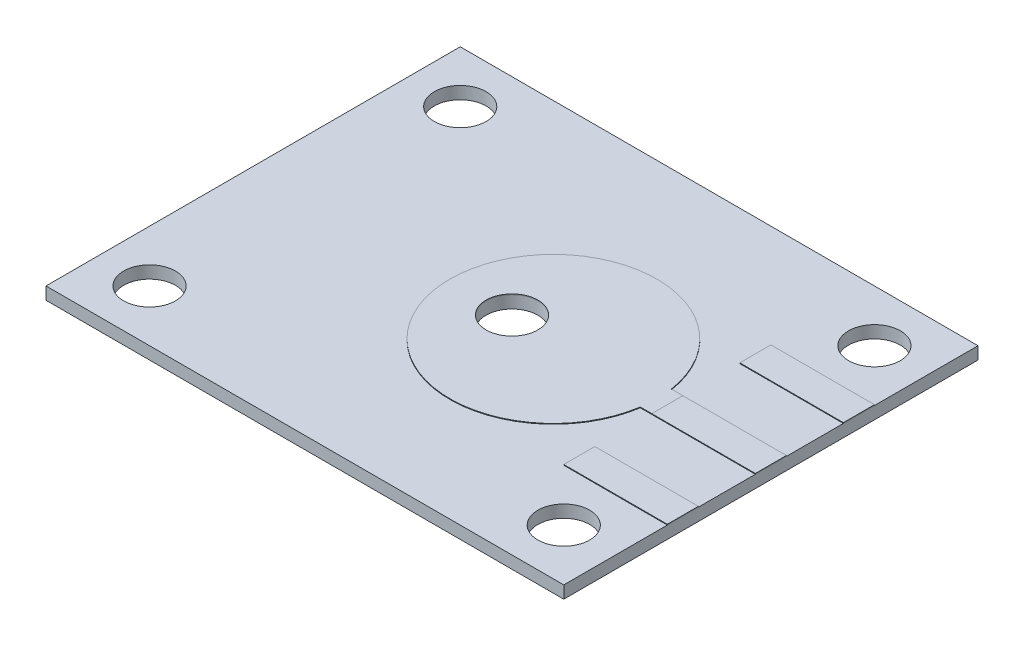
ISO-10303-21;
HEADER;
FILE_DESCRIPTION(('STEP AP214'),'2;1');
FILE_NAME('part.step','',(''),(''),'','','');
FILE_SCHEMA(('AUTOMOTIVE_DESIGN { 1 0 10303 214 1 1 1 1 }'));
ENDSEC;
DATA;
#1=APPLICATION_CONTEXT('core data for automotive mechanical design processes');
#2=APPLICATION_PROTOCOL_DEFINITION('international standard','automotive_design',2000,#1);
#3=PRODUCT_CONTEXT('',#1,'mechanical');
#4=PRODUCT('Part','Part','',(#3));
#5=PRODUCT_RELATED_PRODUCT_CATEGORY('part','',(#4));
#6=PRODUCT_DEFINITION_FORMATION('','',#4);
#7=PRODUCT_DEFINITION_CONTEXT('part definition',#1,'design');
#8=PRODUCT_DEFINITION('design','',#6,#7);
#9=PRODUCT_DEFINITION_SHAPE('','',#8);
#10=(LENGTH_UNIT() NAMED_UNIT(*) SI_UNIT(.MILLI.,.METRE.));
#11=(NAMED_UNIT(*) PLANE_ANGLE_UNIT() SI_UNIT($,.RADIAN.));
#12=(NAMED_UNIT(*) SI_UNIT($,.STERADIAN.) SOLID_ANGLE_UNIT());
#13=UNCERTAINTY_MEASURE_WITH_UNIT(LENGTH_MEASURE(1.E-05),#10,'distance_accuracy_value','');
#14=(GEOMETRIC_REPRESENTATION_CONTEXT(3) GLOBAL_UNCERTAINTY_ASSIGNED_CONTEXT((#13)) GLOBAL_UNIT_ASSIGNED_CONTEXT((#10,
#11,#12)) REPRESENTATION_CONTEXT('',''));
#15=CARTESIAN_POINT('',(0.,0.,0.));
#16=DIRECTION('',(0.,0.,1.));
#17=DIRECTION('',(1.,0.,0.));
#18=AXIS2_PLACEMENT_3D('',#15,#16,#17);
#19=CARTESIAN_POINT('',(2.,0.,0.));
#20=DIRECTION('',(0.,-1.,0.));
#21=DIRECTION('',(0.,0.,-1.));
#22=AXIS2_PLACEMENT_3D('',#19,#20,#21);
#23=CYLINDRICAL_SURFACE('',#22,5.);
#24=CARTESIAN_POINT('',(2.,-0.0350000000000001,0.));
#25=DIRECTION('',(0.,1.,0.));
#26=DIRECTION('',(0.,0.,1.));
#27=AXIS2_PLACEMENT_3D('',#24,#25,#26);
#28=CIRCLE('',#27,5.);
#29=CARTESIAN_POINT('',(6.9434299833213,-0.0350000000000001,-0.75));
#30=VERTEX_POINT('',#29);
#31=CARTESIAN_POINT('',(6.9434299833213,-0.0350000000000001,0.75));
#32=VERTEX_POINT('',#31);
#33=EDGE_CURVE('E124',#30,#32,#28,.T.);
#34=ORIENTED_EDGE('',*,*,#33,.T.);
#35=DIRECTION('',(0.,-1.,0.));
#36=VECTOR('',#35,1.);
#37=CARTESIAN_POINT('',(6.9434299833213,0.,0.75));
#38=LINE('',#37,#36);
#39=CARTESIAN_POINT('',(6.9434299833213,0.,0.75));
#40=VERTEX_POINT('',#39);
#41=EDGE_CURVE('E79',#40,#32,#38,.T.);
#42=ORIENTED_EDGE('',*,*,#41,.F.);
#43=CARTESIAN_POINT('',(2.,0.,0.));
#44=DIRECTION('',(0.,1.,0.));
#45=DIRECTION('',(0.,0.,1.));
#46=AXIS2_PLACEMENT_3D('',#43,#44,#45);
#47=CIRCLE('',#46,5.);
#48=CARTESIAN_POINT('',(6.9434299833213,0.,-0.75));
#49=VERTEX_POINT('',#48);
#50=EDGE_CURVE('E136',#49,#40,#47,.T.);
#51=ORIENTED_EDGE('',*,*,#50,.F.);
#52=DIRECTION('',(0.,-1.,0.));
#53=VECTOR('',#52,1.);
#54=CARTESIAN_POINT('',(6.9434299833213,0.,-0.75));
#55=LINE('',#54,#53);
#56=EDGE_CURVE('E13',#49,#30,#55,.T.);
#57=ORIENTED_EDGE('',*,*,#56,.T.);
#58=EDGE_LOOP('',(#34,#42,#51,#57));
#59=FACE_BOUND('',#58,.T.);
#60=ADVANCED_FACE('F69',(#59),#23,.T.);
#61=CARTESIAN_POINT('',(0.,0.,0.));
#62=DIRECTION('',(0.,-1.,0.));
#63=DIRECTION('',(0.,0.,-1.));
#64=AXIS2_PLACEMENT_3D('',#61,#62,#63);
#65=CYLINDRICAL_SURFACE('',#64,1.25);
#66=CARTESIAN_POINT('',(0.,0.,0.));
#67=DIRECTION('',(0.,1.,0.));
#68=DIRECTION('',(0.,0.,1.));
#69=AXIS2_PLACEMENT_3D('',#66,#67,#68);
#70=CIRCLE('',#69,1.25);
#71=CARTESIAN_POINT('',(0.,0.,1.25));
#72=VERTEX_POINT('',#71);
#73=EDGE_CURVE('E138',#72,#72,#70,.F.);
#74=ORIENTED_EDGE('',*,*,#73,.F.);
#75=EDGE_LOOP('',(#74));
#76=FACE_BOUND('',#75,.T.);
#77=CARTESIAN_POINT('',(0.,-0.0350000000000001,0.));
#78=DIRECTION('',(0.,1.,0.));
#79=DIRECTION('',(0.,0.,1.));
#80=AXIS2_PLACEMENT_3D('',#77,#78,#79);
#81=CIRCLE('',#80,1.25);
#82=CARTESIAN_POINT('',(0.,-0.0350000000000001,1.25));
#83=VERTEX_POINT('',#82);
#84=EDGE_CURVE('E139',#83,#83,#81,.F.);
#85=ORIENTED_EDGE('',*,*,#84,.T.);
#86=EDGE_LOOP('',(#85));
#87=FACE_BOUND('',#86,.T.);
#88=ADVANCED_FACE('F150',(#76,#87),#65,.F.);
#89=CARTESIAN_POINT('',(0.,-0.0350000000000001,0.));
#90=DIRECTION('',(0.,1.,0.));
#91=DIRECTION('',(0.,0.,1.));
#92=AXIS2_PLACEMENT_3D('',#89,#90,#91);
#93=PLANE('',#92);
#94=ORIENTED_EDGE('',*,*,#84,.F.);
#95=EDGE_LOOP('',(#94));
#96=FACE_BOUND('',#95,.T.);
#97=ORIENTED_EDGE('',*,*,#33,.F.);
#98=DIRECTION('',(-1.,0.,0.));
#99=VECTOR('',#98,1.);
#100=CARTESIAN_POINT('',(7.5,-0.0350000000000001,-0.75));
#101=LINE('',#100,#99);
#102=CARTESIAN_POINT('',(7.5,-0.0350000000000001,-0.75));
#103=VERTEX_POINT('',#102);
#104=EDGE_CURVE('E113',#103,#30,#101,.T.);
#105=ORIENTED_EDGE('',*,*,#104,.F.);
#106=DIRECTION('',(0.,0.,1.));
#107=VECTOR('',#106,1.);
#108=CARTESIAN_POINT('',(7.5,-0.0350000000000001,-0.75));
#109=LINE('',#108,#107);
#110=CARTESIAN_POINT('',(7.5,-0.0350000000000001,0.75));
#111=VERTEX_POINT('',#110);
#112=EDGE_CURVE('E123',#103,#111,#109,.T.);
#113=ORIENTED_EDGE('',*,*,#112,.T.);
#114=DIRECTION('',(-1.,0.,0.));
#115=VECTOR('',#114,1.);
#116=CARTESIAN_POINT('',(7.5,-0.0350000000000001,0.75));
#117=LINE('',#116,#115);
#118=EDGE_CURVE('E125',#111,#32,#117,.T.);
#119=ORIENTED_EDGE('',*,*,#118,.T.);
#120=EDGE_LOOP('',(#97,#105,#113,#119));
#121=FACE_BOUND('',#120,.T.);
#122=ADVANCED_FACE('F121',(#96,#121),#93,.F.);
#123=CARTESIAN_POINT('',(0.,0.,0.));
#124=DIRECTION('',(0.,1.,0.));
#125=DIRECTION('',(0.,0.,1.));
#126=AXIS2_PLACEMENT_3D('',#123,#124,#125);
#127=PLANE('',#126);
#128=ORIENTED_EDGE('',*,*,#73,.T.);
#129=EDGE_LOOP('',(#128));
#130=FACE_BOUND('',#129,.T.);
#131=DIRECTION('',(-1.,0.,0.));
#132=VECTOR('',#131,1.);
#133=CARTESIAN_POINT('',(7.5,0.,-0.75));
#134=LINE('',#133,#132);
#135=CARTESIAN_POINT('',(7.5,0.,-0.75));
#136=VERTEX_POINT('',#135);
#137=EDGE_CURVE('E116',#136,#49,#134,.T.);
#138=ORIENTED_EDGE('',*,*,#137,.T.);
#139=ORIENTED_EDGE('',*,*,#50,.T.);
#140=DIRECTION('',(-1.,0.,0.));
#141=VECTOR('',#140,1.);
#142=CARTESIAN_POINT('',(7.5,0.,0.75));
#143=LINE('',#142,#141);
#144=CARTESIAN_POINT('',(7.5,0.,0.75));
#145=VERTEX_POINT('',#144);
#146=EDGE_CURVE('E129',#145,#40,#143,.T.);
#147=ORIENTED_EDGE('',*,*,#146,.F.);
#148=DIRECTION('',(0.,0.,1.));
#149=VECTOR('',#148,1.);
#150=CARTESIAN_POINT('',(7.5,0.,-0.75));
#151=LINE('',#150,#149);
#152=EDGE_CURVE('E118',#136,#145,#151,.T.);
#153=ORIENTED_EDGE('',*,*,#152,.F.);
#154=EDGE_LOOP('',(#138,#139,#147,#153));
#155=FACE_BOUND('',#154,.T.);
#156=ADVANCED_FACE('F147',(#130,#155),#127,.T.);
#157=CARTESIAN_POINT('',(7.5,0.,0.75));
#158=DIRECTION('',(0.,0.,1.));
#159=DIRECTION('',(1.,0.,0.));
#160=AXIS2_PLACEMENT_3D('',#157,#158,#159);
#161=PLANE('',#160);
#162=ORIENTED_EDGE('',*,*,#41,.T.);
#163=ORIENTED_EDGE('',*,*,#118,.F.);
#164=DIRECTION('',(0.,-1.,0.));
#165=VECTOR('',#164,1.);
#166=CARTESIAN_POINT('',(7.5,0.,0.75));
#167=LINE('',#166,#165);
#168=EDGE_CURVE('E73',#145,#111,#167,.T.);
#169=ORIENTED_EDGE('',*,*,#168,.F.);
#170=ORIENTED_EDGE('',*,*,#146,.T.);
#171=EDGE_LOOP('',(#162,#163,#169,#170));
#172=FACE_BOUND('',#171,.T.);
#173=ADVANCED_FACE('F161',(#172),#161,.T.);
#174=CARTESIAN_POINT('',(7.5,0.,-0.75));
#175=DIRECTION('',(1.,0.,0.));
#176=DIRECTION('',(0.,0.,-1.));
#177=AXIS2_PLACEMENT_3D('',#174,#175,#176);
#178=PLANE('',#177);
#179=ORIENTED_EDGE('',*,*,#112,.F.);
#180=DIRECTION('',(0.,-1.,0.));
#181=VECTOR('',#180,1.);
#182=CARTESIAN_POINT('',(7.5,0.,-0.75));
#183=LINE('',#182,#181);
#184=EDGE_CURVE('E111',#136,#103,#183,.T.);
#185=ORIENTED_EDGE('',*,*,#184,.F.);
#186=ORIENTED_EDGE('',*,*,#152,.T.);
#187=ORIENTED_EDGE('',*,*,#168,.T.);
#188=EDGE_LOOP('',(#179,#185,#186,#187));
#189=FACE_BOUND('',#188,.T.);
#190=ADVANCED_FACE('F127',(#189),#178,.T.);
#191=CARTESIAN_POINT('',(7.5,0.,-0.75));
#192=DIRECTION('',(0.,0.,1.));
#193=DIRECTION('',(1.,0.,0.));
#194=AXIS2_PLACEMENT_3D('',#191,#192,#193);
#195=PLANE('',#194);
#196=ORIENTED_EDGE('',*,*,#104,.T.);
#197=ORIENTED_EDGE('',*,*,#56,.F.);
#198=ORIENTED_EDGE('',*,*,#137,.F.);
#199=ORIENTED_EDGE('',*,*,#184,.T.);
#200=EDGE_LOOP('',(#196,#197,#198,#199));
#201=FACE_BOUND('',#200,.T.);
#202=ADVANCED_FACE('F71',(#201),#195,.F.);
#203=CLOSED_SHELL('',(#60,#88,#122,#156,#173,#190,#202));
#204=MANIFOLD_SOLID_BREP('B2',#203);
#205=CARTESIAN_POINT('',(7.50000000000004,-0.2,3.5));
#206=DIRECTION('',(0.,0.,-1.));
#207=DIRECTION('',(-1.,0.,0.));
#208=AXIS2_PLACEMENT_3D('',#205,#206,#207);
#209=PLANE('',#208);
#210=DIRECTION('',(-1.,0.,0.));
#211=VECTOR('',#210,1.);
#212=CARTESIAN_POINT('',(7.50000000000004,0.,3.5));
#213=LINE('',#212,#211);
#214=CARTESIAN_POINT('',(12.5,0.,3.5));
#215=VERTEX_POINT('',#214);
#216=CARTESIAN_POINT('',(7.50000000000004,0.,3.5));
#217=VERTEX_POINT('',#216);
#218=EDGE_CURVE('E293',#215,#217,#213,.T.);
#219=ORIENTED_EDGE('',*,*,#218,.F.);
#220=DIRECTION('',(0.,1.,0.));
#221=VECTOR('',#220,1.);
#222=CARTESIAN_POINT('',(12.5,-0.2,3.5));
#223=LINE('',#222,#221);
#224=CARTESIAN_POINT('',(12.5,-0.2,3.5));
#225=VERTEX_POINT('',#224);
#226=EDGE_CURVE('E67',#225,#215,#223,.T.);
#227=ORIENTED_EDGE('',*,*,#226,.F.);
#228=DIRECTION('',(-1.,0.,0.));
#229=VECTOR('',#228,1.);
#230=CARTESIAN_POINT('',(7.50000000000004,-0.2,3.5));
#231=LINE('',#230,#229);
#232=CARTESIAN_POINT('',(7.50000000000004,-0.2,3.5));
#233=VERTEX_POINT('',#232);
#234=EDGE_CURVE('E287',#225,#233,#231,.T.);
#235=ORIENTED_EDGE('',*,*,#234,.T.);
#236=DIRECTION('',(0.,1.,0.));
#237=VECTOR('',#236,1.);
#238=CARTESIAN_POINT('',(7.50000000000004,-0.2,3.5));
#239=LINE('',#238,#237);
#240=EDGE_CURVE('E232',#233,#217,#239,.T.);
#241=ORIENTED_EDGE('',*,*,#240,.T.);
#242=EDGE_LOOP('',(#219,#227,#235,#241));
#243=FACE_BOUND('',#242,.T.);
#244=ADVANCED_FACE('F229',(#243),#209,.T.);
#245=CARTESIAN_POINT('',(12.5,-0.2,5.));
#246=DIRECTION('',(1.,0.,0.));
#247=DIRECTION('',(0.,0.,-1.));
#248=AXIS2_PLACEMENT_3D('',#245,#246,#247);
#249=PLANE('',#248);
#250=DIRECTION('',(0.,0.,-1.));
#251=VECTOR('',#250,1.);
#252=CARTESIAN_POINT('',(12.5,0.,5.));
#253=LINE('',#252,#251);
#254=CARTESIAN_POINT('',(12.5,0.,5.));
#255=VERTEX_POINT('',#254);
#256=EDGE_CURVE('E289',#255,#215,#253,.T.);
#257=ORIENTED_EDGE('',*,*,#256,.F.);
#258=DIRECTION('',(0.,1.,0.));
#259=VECTOR('',#258,1.);
#260=CARTESIAN_POINT('',(12.5,-0.2,5.));
#261=LINE('',#260,#259);
#262=CARTESIAN_POINT('',(12.5,-0.2,5.));
#263=VERTEX_POINT('',#262);
#264=EDGE_CURVE('E238',#263,#255,#261,.T.);
#265=ORIENTED_EDGE('',*,*,#264,.F.);
#266=DIRECTION('',(0.,0.,-1.));
#267=VECTOR('',#266,1.);
#268=CARTESIAN_POINT('',(12.5,-0.2,5.));
#269=LINE('',#268,#267);
#270=EDGE_CURVE('E284',#263,#225,#269,.T.);
#271=ORIENTED_EDGE('',*,*,#270,.T.);
#272=ORIENTED_EDGE('',*,*,#226,.T.);
#273=EDGE_LOOP('',(#257,#265,#271,#272));
#274=FACE_BOUND('',#273,.T.);
#275=ADVANCED_FACE('F303',(#274),#249,.T.);
#276=CARTESIAN_POINT('',(7.50000000000004,-0.2,5.));
#277=DIRECTION('',(0.,0.,1.));
#278=DIRECTION('',(1.,0.,0.));
#279=AXIS2_PLACEMENT_3D('',#276,#277,#278);
#280=PLANE('',#279);
#281=DIRECTION('',(1.,0.,0.));
#282=VECTOR('',#281,1.);
#283=CARTESIAN_POINT('',(7.50000000000004,0.,5.));
#284=LINE('',#283,#282);
#285=CARTESIAN_POINT('',(7.50000000000004,0.,5.));
#286=VERTEX_POINT('',#285);
#287=EDGE_CURVE('E279',#286,#255,#284,.T.);
#288=ORIENTED_EDGE('',*,*,#287,.F.);
#289=DIRECTION('',(0.,1.,0.));
#290=VECTOR('',#289,1.);
#291=CARTESIAN_POINT('',(7.50000000000004,-0.2,5.));
#292=LINE('',#291,#290);
#293=CARTESIAN_POINT('',(7.50000000000004,-0.2,5.));
#294=VERTEX_POINT('',#293);
#295=EDGE_CURVE('E274',#294,#286,#292,.T.);
#296=ORIENTED_EDGE('',*,*,#295,.F.);
#297=DIRECTION('',(1.,0.,0.));
#298=VECTOR('',#297,1.);
#299=CARTESIAN_POINT('',(7.50000000000004,-0.2,5.));
#300=LINE('',#299,#298);
#301=EDGE_CURVE('E277',#294,#263,#300,.T.);
#302=ORIENTED_EDGE('',*,*,#301,.T.);
#303=ORIENTED_EDGE('',*,*,#264,.T.);
#304=EDGE_LOOP('',(#288,#296,#302,#303));
#305=FACE_BOUND('',#304,.T.);
#306=ADVANCED_FACE('F276',(#305),#280,.T.);
#307=CARTESIAN_POINT('',(7.50000000000004,-0.2,5.));
#308=DIRECTION('',(-1.,0.,0.));
#309=DIRECTION('',(0.,0.,1.));
#310=AXIS2_PLACEMENT_3D('',#307,#308,#309);
#311=PLANE('',#310);
#312=DIRECTION('',(0.,0.,1.));
#313=VECTOR('',#312,1.);
#314=CARTESIAN_POINT('',(7.50000000000004,0.,5.));
#315=LINE('',#314,#313);
#316=EDGE_CURVE('E296',#217,#286,#315,.T.);
#317=ORIENTED_EDGE('',*,*,#316,.F.);
#318=ORIENTED_EDGE('',*,*,#240,.F.);
#319=DIRECTION('',(0.,0.,1.));
#320=VECTOR('',#319,1.);
#321=CARTESIAN_POINT('',(7.50000000000004,-0.2,5.));
#322=LINE('',#321,#320);
#323=EDGE_CURVE('E283',#233,#294,#322,.T.);
#324=ORIENTED_EDGE('',*,*,#323,.T.);
#325=ORIENTED_EDGE('',*,*,#295,.T.);
#326=EDGE_LOOP('',(#317,#318,#324,#325));
#327=FACE_BOUND('',#326,.T.);
#328=ADVANCED_FACE('F286',(#327),#311,.T.);
#329=CARTESIAN_POINT('',(0.,-0.2,0.));
#330=DIRECTION('',(0.,1.,0.));
#331=DIRECTION('',(0.,0.,1.));
#332=AXIS2_PLACEMENT_3D('',#329,#330,#331);
#333=PLANE('',#332);
#334=ORIENTED_EDGE('',*,*,#234,.F.);
#335=ORIENTED_EDGE('',*,*,#270,.F.);
#336=ORIENTED_EDGE('',*,*,#301,.F.);
#337=ORIENTED_EDGE('',*,*,#323,.F.);
#338=EDGE_LOOP('',(#334,#335,#336,#337));
#339=FACE_BOUND('',#338,.T.);
#340=ADVANCED_FACE('F282',(#339),#333,.F.);
#341=CARTESIAN_POINT('',(0.,0.,0.));
#342=DIRECTION('',(0.,1.,0.));
#343=DIRECTION('',(0.,0.,1.));
#344=AXIS2_PLACEMENT_3D('',#341,#342,#343);
#345=PLANE('',#344);
#346=ORIENTED_EDGE('',*,*,#218,.T.);
#347=ORIENTED_EDGE('',*,*,#316,.T.);
#348=ORIENTED_EDGE('',*,*,#287,.T.);
#349=ORIENTED_EDGE('',*,*,#256,.T.);
#350=EDGE_LOOP('',(#346,#347,#348,#349));
#351=FACE_BOUND('',#350,.T.);
#352=ADVANCED_FACE('F302',(#351),#345,.T.);
#353=CLOSED_SHELL('',(#244,#275,#306,#328,#340,#352));
#354=MANIFOLD_SOLID_BREP('B7',#353);
#355=CARTESIAN_POINT('',(7.49999999999998,-0.2,-5.));
#356=DIRECTION('',(0.,0.,-1.));
#357=DIRECTION('',(-1.,0.,0.));
#358=AXIS2_PLACEMENT_3D('',#355,#356,#357);
#359=PLANE('',#358);
#360=DIRECTION('',(-1.,0.,0.));
#361=VECTOR('',#360,1.);
#362=CARTESIAN_POINT('',(7.49999999999998,0.,-5.));
#363=LINE('',#362,#361);
#364=CARTESIAN_POINT('',(12.5,0.,-5.));
#365=VERTEX_POINT('',#364);
#366=CARTESIAN_POINT('',(7.49999999999998,0.,-5.));
#367=VERTEX_POINT('',#366);
#368=EDGE_CURVE('E426',#365,#367,#363,.T.);
#369=ORIENTED_EDGE('',*,*,#368,.F.);
#370=DIRECTION('',(0.,1.,0.));
#371=VECTOR('',#370,1.);
#372=CARTESIAN_POINT('',(12.5,-0.2,-5.));
#373=LINE('',#372,#371);
#374=CARTESIAN_POINT('',(12.5,-0.2,-5.));
#375=VERTEX_POINT('',#374);
#376=EDGE_CURVE('E227',#375,#365,#373,.T.);
#377=ORIENTED_EDGE('',*,*,#376,.F.);
#378=DIRECTION('',(-1.,0.,0.));
#379=VECTOR('',#378,1.);
#380=CARTESIAN_POINT('',(7.49999999999998,-0.2,-5.));
#381=LINE('',#380,#379);
#382=CARTESIAN_POINT('',(7.49999999999998,-0.2,-5.));
#383=VERTEX_POINT('',#382);
#384=EDGE_CURVE('E420',#375,#383,#381,.T.);
#385=ORIENTED_EDGE('',*,*,#384,.T.);
#386=DIRECTION('',(0.,1.,0.));
#387=VECTOR('',#386,1.);
#388=CARTESIAN_POINT('',(7.49999999999998,-0.2,-5.));
#389=LINE('',#388,#387);
#390=EDGE_CURVE('E365',#383,#367,#389,.T.);
#391=ORIENTED_EDGE('',*,*,#390,.T.);
#392=EDGE_LOOP('',(#369,#377,#385,#391));
#393=FACE_BOUND('',#392,.T.);
#394=ADVANCED_FACE('F362',(#393),#359,.T.);
#395=CARTESIAN_POINT('',(12.5,-0.2,-3.5));
#396=DIRECTION('',(1.,0.,0.));
#397=DIRECTION('',(0.,0.,-1.));
#398=AXIS2_PLACEMENT_3D('',#395,#396,#397);
#399=PLANE('',#398);
#400=DIRECTION('',(0.,0.,-1.));
#401=VECTOR('',#400,1.);
#402=CARTESIAN_POINT('',(12.5,0.,-3.5));
#403=LINE('',#402,#401);
#404=CARTESIAN_POINT('',(12.5,0.,-3.5));
#405=VERTEX_POINT('',#404);
#406=EDGE_CURVE('E422',#405,#365,#403,.T.);
#407=ORIENTED_EDGE('',*,*,#406,.F.);
#408=DIRECTION('',(0.,1.,0.));
#409=VECTOR('',#408,1.);
#410=CARTESIAN_POINT('',(12.5,-0.2,-3.5));
#411=LINE('',#410,#409);
#412=CARTESIAN_POINT('',(12.5,-0.2,-3.5));
#413=VERTEX_POINT('',#412);
#414=EDGE_CURVE('E371',#413,#405,#411,.T.);
#415=ORIENTED_EDGE('',*,*,#414,.F.);
#416=DIRECTION('',(0.,0.,-1.));
#417=VECTOR('',#416,1.);
#418=CARTESIAN_POINT('',(12.5,-0.2,-3.5));
#419=LINE('',#418,#417);
#420=EDGE_CURVE('E417',#413,#375,#419,.T.);
#421=ORIENTED_EDGE('',*,*,#420,.T.);
#422=ORIENTED_EDGE('',*,*,#376,.T.);
#423=EDGE_LOOP('',(#407,#415,#421,#422));
#424=FACE_BOUND('',#423,.T.);
#425=ADVANCED_FACE('F436',(#424),#399,.T.);
#426=CARTESIAN_POINT('',(7.49999999999998,-0.2,-3.5));
#427=DIRECTION('',(0.,0.,1.));
#428=DIRECTION('',(1.,0.,0.));
#429=AXIS2_PLACEMENT_3D('',#426,#427,#428);
#430=PLANE('',#429);
#431=DIRECTION('',(1.,0.,0.));
#432=VECTOR('',#431,1.);
#433=CARTESIAN_POINT('',(7.49999999999998,0.,-3.5));
#434=LINE('',#433,#432);
#435=CARTESIAN_POINT('',(7.49999999999998,0.,-3.5));
#436=VERTEX_POINT('',#435);
#437=EDGE_CURVE('E412',#436,#405,#434,.T.);
#438=ORIENTED_EDGE('',*,*,#437,.F.);
#439=DIRECTION('',(0.,1.,0.));
#440=VECTOR('',#439,1.);
#441=CARTESIAN_POINT('',(7.49999999999998,-0.2,-3.5));
#442=LINE('',#441,#440);
#443=CARTESIAN_POINT('',(7.49999999999998,-0.2,-3.5));
#444=VERTEX_POINT('',#443);
#445=EDGE_CURVE('E407',#444,#436,#442,.T.);
#446=ORIENTED_EDGE('',*,*,#445,.F.);
#447=DIRECTION('',(1.,0.,0.));
#448=VECTOR('',#447,1.);
#449=CARTESIAN_POINT('',(7.49999999999998,-0.2,-3.5));
#450=LINE('',#449,#448);
#451=EDGE_CURVE('E410',#444,#413,#450,.T.);
#452=ORIENTED_EDGE('',*,*,#451,.T.);
#453=ORIENTED_EDGE('',*,*,#414,.T.);
#454=EDGE_LOOP('',(#438,#446,#452,#453));
#455=FACE_BOUND('',#454,.T.);
#456=ADVANCED_FACE('F409',(#455),#430,.T.);
#457=CARTESIAN_POINT('',(7.49999999999998,-0.2,-3.5));
#458=DIRECTION('',(-1.,0.,0.));
#459=DIRECTION('',(0.,0.,1.));
#460=AXIS2_PLACEMENT_3D('',#457,#458,#459);
#461=PLANE('',#460);
#462=DIRECTION('',(0.,0.,1.));
#463=VECTOR('',#462,1.);
#464=CARTESIAN_POINT('',(7.49999999999998,0.,-3.5));
#465=LINE('',#464,#463);
#466=EDGE_CURVE('E429',#367,#436,#465,.T.);
#467=ORIENTED_EDGE('',*,*,#466,.F.);
#468=ORIENTED_EDGE('',*,*,#390,.F.);
#469=DIRECTION('',(0.,0.,1.));
#470=VECTOR('',#469,1.);
#471=CARTESIAN_POINT('',(7.49999999999998,-0.2,-3.5));
#472=LINE('',#471,#470);
#473=EDGE_CURVE('E416',#383,#444,#472,.T.);
#474=ORIENTED_EDGE('',*,*,#473,.T.);
#475=ORIENTED_EDGE('',*,*,#445,.T.);
#476=EDGE_LOOP('',(#467,#468,#474,#475));
#477=FACE_BOUND('',#476,.T.);
#478=ADVANCED_FACE('F419',(#477),#461,.T.);
#479=CARTESIAN_POINT('',(0.,-0.2,0.));
#480=DIRECTION('',(0.,1.,0.));
#481=DIRECTION('',(0.,0.,1.));
#482=AXIS2_PLACEMENT_3D('',#479,#480,#481);
#483=PLANE('',#482);
#484=ORIENTED_EDGE('',*,*,#384,.F.);
#485=ORIENTED_EDGE('',*,*,#420,.F.);
#486=ORIENTED_EDGE('',*,*,#451,.F.);
#487=ORIENTED_EDGE('',*,*,#473,.F.);
#488=EDGE_LOOP('',(#484,#485,#486,#487));
#489=FACE_BOUND('',#488,.T.);
#490=ADVANCED_FACE('F415',(#489),#483,.F.);
#491=CARTESIAN_POINT('',(0.,0.,0.));
#492=DIRECTION('',(0.,1.,0.));
#493=DIRECTION('',(0.,0.,1.));
#494=AXIS2_PLACEMENT_3D('',#491,#492,#493);
#495=PLANE('',#494);
#496=ORIENTED_EDGE('',*,*,#368,.T.);
#497=ORIENTED_EDGE('',*,*,#466,.T.);
#498=ORIENTED_EDGE('',*,*,#437,.T.);
#499=ORIENTED_EDGE('',*,*,#406,.T.);
#500=EDGE_LOOP('',(#496,#497,#498,#499));
#501=FACE_BOUND('',#500,.T.);
#502=ADVANCED_FACE('F435',(#501),#495,.T.);
#503=CLOSED_SHELL('',(#394,#425,#456,#478,#490,#502));
#504=MANIFOLD_SOLID_BREP('B61',#503);
#505=CARTESIAN_POINT('',(12.5,-0.2,0.75));
#506=DIRECTION('',(1.,0.,0.));
#507=DIRECTION('',(0.,0.,-1.));
#508=AXIS2_PLACEMENT_3D('',#505,#506,#507);
#509=PLANE('',#508);
#510=DIRECTION('',(0.,0.,-1.));
#511=VECTOR('',#510,1.);
#512=CARTESIAN_POINT('',(12.5,0.,0.75));
#513=LINE('',#512,#511);
#514=CARTESIAN_POINT('',(12.5,0.,0.75));
#515=VERTEX_POINT('',#514);
#516=CARTESIAN_POINT('',(12.5,0.,-0.75));
#517=VERTEX_POINT('',#516);
#518=EDGE_CURVE('E558',#515,#517,#513,.T.);
#519=ORIENTED_EDGE('',*,*,#518,.F.);
#520=DIRECTION('',(0.,1.,0.));
#521=VECTOR('',#520,1.);
#522=CARTESIAN_POINT('',(12.5,-0.2,0.75));
#523=LINE('',#522,#521);
#524=CARTESIAN_POINT('',(12.5,-0.2,0.75));
#525=VERTEX_POINT('',#524);
#526=EDGE_CURVE('E360',#525,#515,#523,.T.);
#527=ORIENTED_EDGE('',*,*,#526,.F.);
#528=DIRECTION('',(0.,0.,-1.));
#529=VECTOR('',#528,1.);
#530=CARTESIAN_POINT('',(12.5,-0.2,0.75));
#531=LINE('',#530,#529);
#532=CARTESIAN_POINT('',(12.5,-0.2,-0.75));
#533=VERTEX_POINT('',#532);
#534=EDGE_CURVE('E552',#525,#533,#531,.T.);
#535=ORIENTED_EDGE('',*,*,#534,.T.);
#536=DIRECTION('',(0.,1.,0.));
#537=VECTOR('',#536,1.);
#538=CARTESIAN_POINT('',(12.5,-0.2,-0.75));
#539=LINE('',#538,#537);
#540=EDGE_CURVE('E497',#533,#517,#539,.T.);
#541=ORIENTED_EDGE('',*,*,#540,.T.);
#542=EDGE_LOOP('',(#519,#527,#535,#541));
#543=FACE_BOUND('',#542,.T.);
#544=ADVANCED_FACE('F494',(#543),#509,.T.);
#545=CARTESIAN_POINT('',(7.5,-0.2,0.75));
#546=DIRECTION('',(0.,0.,1.));
#547=DIRECTION('',(1.,0.,0.));
#548=AXIS2_PLACEMENT_3D('',#545,#546,#547);
#549=PLANE('',#548);
#550=DIRECTION('',(1.,0.,0.));
#551=VECTOR('',#550,1.);
#552=CARTESIAN_POINT('',(7.5,0.,0.75));
#553=LINE('',#552,#551);
#554=CARTESIAN_POINT('',(7.5,0.,0.75));
#555=VERTEX_POINT('',#554);
#556=EDGE_CURVE('E554',#555,#515,#553,.T.);
#557=ORIENTED_EDGE('',*,*,#556,.F.);
#558=DIRECTION('',(0.,1.,0.));
#559=VECTOR('',#558,1.);
#560=CARTESIAN_POINT('',(7.5,-0.2,0.75));
#561=LINE('',#560,#559);
#562=CARTESIAN_POINT('',(7.5,-0.2,0.75));
#563=VERTEX_POINT('',#562);
#564=EDGE_CURVE('E503',#563,#555,#561,.T.);
#565=ORIENTED_EDGE('',*,*,#564,.F.);
#566=DIRECTION('',(1.,0.,0.));
#567=VECTOR('',#566,1.);
#568=CARTESIAN_POINT('',(7.5,-0.2,0.75));
#569=LINE('',#568,#567);
#570=EDGE_CURVE('E549',#563,#525,#569,.T.);
#571=ORIENTED_EDGE('',*,*,#570,.T.);
#572=ORIENTED_EDGE('',*,*,#526,.T.);
#573=EDGE_LOOP('',(#557,#565,#571,#572));
#574=FACE_BOUND('',#573,.T.);
#575=ADVANCED_FACE('F568',(#574),#549,.T.);
#576=CARTESIAN_POINT('',(7.5,-0.2,0.75));
#577=DIRECTION('',(-1.,0.,0.));
#578=DIRECTION('',(0.,0.,1.));
#579=AXIS2_PLACEMENT_3D('',#576,#577,#578);
#580=PLANE('',#579);
#581=DIRECTION('',(0.,0.,1.));
#582=VECTOR('',#581,1.);
#583=CARTESIAN_POINT('',(7.5,0.,0.75));
#584=LINE('',#583,#582);
#585=CARTESIAN_POINT('',(7.5,0.,-0.75));
#586=VERTEX_POINT('',#585);
#587=EDGE_CURVE('E544',#586,#555,#584,.T.);
#588=ORIENTED_EDGE('',*,*,#587,.F.);
#589=DIRECTION('',(0.,1.,0.));
#590=VECTOR('',#589,1.);
#591=CARTESIAN_POINT('',(7.5,-0.2,-0.75));
#592=LINE('',#591,#590);
#593=CARTESIAN_POINT('',(7.5,-0.2,-0.75));
#594=VERTEX_POINT('',#593);
#595=EDGE_CURVE('E539',#594,#586,#592,.T.);
#596=ORIENTED_EDGE('',*,*,#595,.F.);
#597=DIRECTION('',(0.,0.,1.));
#598=VECTOR('',#597,1.);
#599=CARTESIAN_POINT('',(7.5,-0.2,0.75));
#600=LINE('',#599,#598);
#601=EDGE_CURVE('E542',#594,#563,#600,.T.);
#602=ORIENTED_EDGE('',*,*,#601,.T.);
#603=ORIENTED_EDGE('',*,*,#564,.T.);
#604=EDGE_LOOP('',(#588,#596,#602,#603));
#605=FACE_BOUND('',#604,.T.);
#606=ADVANCED_FACE('F541',(#605),#580,.T.);
#607=CARTESIAN_POINT('',(7.5,-0.2,-0.75));
#608=DIRECTION('',(0.,0.,-1.));
#609=DIRECTION('',(-1.,0.,0.));
#610=AXIS2_PLACEMENT_3D('',#607,#608,#609);
#611=PLANE('',#610);
#612=DIRECTION('',(-1.,0.,0.));
#613=VECTOR('',#612,1.);
#614=CARTESIAN_POINT('',(7.5,0.,-0.75));
#615=LINE('',#614,#613);
#616=EDGE_CURVE('E561',#517,#586,#615,.T.);
#617=ORIENTED_EDGE('',*,*,#616,.F.);
#618=ORIENTED_EDGE('',*,*,#540,.F.);
#619=DIRECTION('',(-1.,0.,0.));
#620=VECTOR('',#619,1.);
#621=CARTESIAN_POINT('',(7.5,-0.2,-0.75));
#622=LINE('',#621,#620);
#623=EDGE_CURVE('E548',#533,#594,#622,.T.);
#624=ORIENTED_EDGE('',*,*,#623,.T.);
#625=ORIENTED_EDGE('',*,*,#595,.T.);
#626=EDGE_LOOP('',(#617,#618,#624,#625));
#627=FACE_BOUND('',#626,.T.);
#628=ADVANCED_FACE('F551',(#627),#611,.T.);
#629=CARTESIAN_POINT('',(0.,-0.2,0.));
#630=DIRECTION('',(0.,-1.,0.));
#631=DIRECTION('',(0.,0.,-1.));
#632=AXIS2_PLACEMENT_3D('',#629,#630,#631);
#633=PLANE('',#632);
#634=ORIENTED_EDGE('',*,*,#534,.F.);
#635=ORIENTED_EDGE('',*,*,#570,.F.);
#636=ORIENTED_EDGE('',*,*,#601,.F.);
#637=ORIENTED_EDGE('',*,*,#623,.F.);
#638=EDGE_LOOP('',(#634,#635,#636,#637));
#639=FACE_BOUND('',#638,.T.);
#640=ADVANCED_FACE('F547',(#639),#633,.T.);
#641=CARTESIAN_POINT('',(0.,0.,0.));
#642=DIRECTION('',(0.,-1.,0.));
#643=DIRECTION('',(0.,0.,-1.));
#644=AXIS2_PLACEMENT_3D('',#641,#642,#643);
#645=PLANE('',#644);
#646=ORIENTED_EDGE('',*,*,#518,.T.);
#647=ORIENTED_EDGE('',*,*,#616,.T.);
#648=ORIENTED_EDGE('',*,*,#587,.T.);
#649=ORIENTED_EDGE('',*,*,#556,.T.);
#650=EDGE_LOOP('',(#646,#647,#648,#649));
#651=FACE_BOUND('',#650,.T.);
#652=ADVANCED_FACE('F567',(#651),#645,.F.);
#653=CLOSED_SHELL('',(#544,#575,#606,#628,#640,#652));
#654=MANIFOLD_SOLID_BREP('B221',#653);
#655=CARTESIAN_POINT('',(12.5,-0.0350000000000001,10.));
#656=DIRECTION('',(-1.,0.,0.));
#657=DIRECTION('',(0.,0.,1.));
#658=AXIS2_PLACEMENT_3D('',#655,#656,#657);
#659=PLANE('',#658);
#660=DIRECTION('',(0.,0.,-1.));
#661=VECTOR('',#660,1.);
#662=CARTESIAN_POINT('',(12.5,-0.635,10.));
#663=LINE('',#662,#661);
#664=CARTESIAN_POINT('',(12.5,-0.635,10.));
#665=VERTEX_POINT('',#664);
#666=CARTESIAN_POINT('',(12.5,-0.635,-10.));
#667=VERTEX_POINT('',#666);
#668=EDGE_CURVE('E680',#665,#667,#663,.T.);
#669=ORIENTED_EDGE('',*,*,#668,.T.);
#670=DIRECTION('',(0.,-1.,0.));
#671=VECTOR('',#670,1.);
#672=CARTESIAN_POINT('',(12.5,-0.0350000000000001,-10.));
#673=LINE('',#672,#671);
#674=CARTESIAN_POINT('',(12.5,-0.0350000000000001,-10.));
#675=VERTEX_POINT('',#674);
#676=EDGE_CURVE('E492',#675,#667,#673,.T.);
#677=ORIENTED_EDGE('',*,*,#676,.F.);
#678=DIRECTION('',(0.,0.,-1.));
#679=VECTOR('',#678,1.);
#680=CARTESIAN_POINT('',(12.5,-0.0350000000000001,10.));
#681=LINE('',#680,#679);
#682=CARTESIAN_POINT('',(12.5,-0.0350000000000001,10.));
#683=VERTEX_POINT('',#682);
#684=EDGE_CURVE('E668',#683,#675,#681,.T.);
#685=ORIENTED_EDGE('',*,*,#684,.F.);
#686=DIRECTION('',(0.,-1.,0.));
#687=VECTOR('',#686,1.);
#688=CARTESIAN_POINT('',(12.5,-0.0350000000000001,10.));
#689=LINE('',#688,#687);
#690=EDGE_CURVE('E676',#683,#665,#689,.T.);
#691=ORIENTED_EDGE('',*,*,#690,.T.);
#692=EDGE_LOOP('',(#669,#677,#685,#691));
#693=FACE_BOUND('',#692,.T.);
#694=ADVANCED_FACE('F617',(#693),#659,.F.);
#695=CARTESIAN_POINT('',(-12.5,-0.0350000000000001,-10.));
#696=DIRECTION('',(0.,0.,1.));
#697=DIRECTION('',(1.,0.,0.));
#698=AXIS2_PLACEMENT_3D('',#695,#696,#697);
#699=PLANE('',#698);
#700=DIRECTION('',(-1.,0.,0.));
#701=VECTOR('',#700,1.);
#702=CARTESIAN_POINT('',(-12.5,-0.635,-10.));
#703=LINE('',#702,#701);
#704=CARTESIAN_POINT('',(-12.5,-0.635,-10.));
#705=VERTEX_POINT('',#704);
#706=EDGE_CURVE('E672',#667,#705,#703,.T.);
#707=ORIENTED_EDGE('',*,*,#706,.T.);
#708=DIRECTION('',(0.,-1.,0.));
#709=VECTOR('',#708,1.);
#710=CARTESIAN_POINT('',(-12.5,-0.0350000000000001,-10.));
#711=LINE('',#710,#709);
#712=CARTESIAN_POINT('',(-12.5,-0.0350000000000001,-10.));
#713=VERTEX_POINT('',#712);
#714=EDGE_CURVE('E625',#713,#705,#711,.T.);
#715=ORIENTED_EDGE('',*,*,#714,.F.);
#716=DIRECTION('',(-1.,0.,0.));
#717=VECTOR('',#716,1.);
#718=CARTESIAN_POINT('',(-12.5,-0.0350000000000001,-10.));
#719=LINE('',#718,#717);
#720=EDGE_CURVE('E663',#675,#713,#719,.T.);
#721=ORIENTED_EDGE('',*,*,#720,.F.);
#722=ORIENTED_EDGE('',*,*,#676,.T.);
#723=EDGE_LOOP('',(#707,#715,#721,#722));
#724=FACE_BOUND('',#723,.T.);
#725=ADVANCED_FACE('F671',(#724),#699,.F.);
#726=CARTESIAN_POINT('',(-12.5,-0.0350000000000001,10.));
#727=DIRECTION('',(1.,0.,0.));
#728=DIRECTION('',(0.,0.,-1.));
#729=AXIS2_PLACEMENT_3D('',#726,#727,#728);
#730=PLANE('',#729);
#731=DIRECTION('',(0.,0.,1.));
#732=VECTOR('',#731,1.);
#733=CARTESIAN_POINT('',(-12.5,-0.635,10.));
#734=LINE('',#733,#732);
#735=CARTESIAN_POINT('',(-12.5,-0.635,10.));
#736=VERTEX_POINT('',#735);
#737=EDGE_CURVE('E650',#705,#736,#734,.T.);
#738=ORIENTED_EDGE('',*,*,#737,.T.);
#739=DIRECTION('',(0.,-1.,0.));
#740=VECTOR('',#739,1.);
#741=CARTESIAN_POINT('',(-12.5,-0.0350000000000001,10.));
#742=LINE('',#741,#740);
#743=CARTESIAN_POINT('',(-12.5,-0.0350000000000001,10.));
#744=VERTEX_POINT('',#743);
#745=EDGE_CURVE('E673',#744,#736,#742,.T.);
#746=ORIENTED_EDGE('',*,*,#745,.F.);
#747=DIRECTION('',(0.,0.,1.));
#748=VECTOR('',#747,1.);
#749=CARTESIAN_POINT('',(-12.5,-0.0350000000000001,10.));
#750=LINE('',#749,#748);
#751=EDGE_CURVE('E666',#713,#744,#750,.T.);
#752=ORIENTED_EDGE('',*,*,#751,.F.);
#753=ORIENTED_EDGE('',*,*,#714,.T.);
#754=EDGE_LOOP('',(#738,#746,#752,#753));
#755=FACE_BOUND('',#754,.T.);
#756=ADVANCED_FACE('F674',(#755),#730,.F.);
#757=CARTESIAN_POINT('',(-12.5,-0.0350000000000001,10.));
#758=DIRECTION('',(0.,0.,-1.));
#759=DIRECTION('',(-1.,0.,0.));
#760=AXIS2_PLACEMENT_3D('',#757,#758,#759);
#761=PLANE('',#760);
#762=DIRECTION('',(1.,0.,0.));
#763=VECTOR('',#762,1.);
#764=CARTESIAN_POINT('',(-12.5,-0.635,10.));
#765=LINE('',#764,#763);
#766=EDGE_CURVE('E656',#736,#665,#765,.T.);
#767=ORIENTED_EDGE('',*,*,#766,.T.);
#768=ORIENTED_EDGE('',*,*,#690,.F.);
#769=DIRECTION('',(1.,0.,0.));
#770=VECTOR('',#769,1.);
#771=CARTESIAN_POINT('',(-12.5,-0.0350000000000001,10.));
#772=LINE('',#771,#770);
#773=EDGE_CURVE('E633',#744,#683,#772,.T.);
#774=ORIENTED_EDGE('',*,*,#773,.F.);
#775=ORIENTED_EDGE('',*,*,#745,.T.);
#776=EDGE_LOOP('',(#767,#768,#774,#775));
#777=FACE_BOUND('',#776,.T.);
#778=ADVANCED_FACE('F688',(#777),#761,.F.);
#779=CARTESIAN_POINT('',(0.,-0.0350000000000001,0.));
#780=DIRECTION('',(0.,-1.,0.));
#781=DIRECTION('',(0.,0.,-1.));
#782=AXIS2_PLACEMENT_3D('',#779,#780,#781);
#783=PLANE('',#782);
#784=CARTESIAN_POINT('',(-10.,-0.0350000000000001,7.5));
#785=DIRECTION('',(0.,1.,0.));
#786=DIRECTION('',(0.,0.,-1.));
#787=AXIS2_PLACEMENT_3D('',#784,#785,#786);
#788=CIRCLE('',#787,1.25);
#789=CARTESIAN_POINT('',(-10.,-0.0350000000000001,6.25));
#790=VERTEX_POINT('',#789);
#791=EDGE_CURVE('E700',#790,#790,#788,.T.);
#792=ORIENTED_EDGE('',*,*,#791,.F.);
#793=EDGE_LOOP('',(#792));
#794=FACE_BOUND('',#793,.T.);
#795=CARTESIAN_POINT('',(10.,-0.0350000000000001,7.5));
#796=DIRECTION('',(0.,1.,0.));
#797=DIRECTION('',(0.,0.,1.));
#798=AXIS2_PLACEMENT_3D('',#795,#796,#797);
#799=CIRCLE('',#798,1.25);
#800=CARTESIAN_POINT('',(10.,-0.0350000000000001,8.75));
#801=VERTEX_POINT('',#800);
#802=EDGE_CURVE('E706',#801,#801,#799,.T.);
#803=ORIENTED_EDGE('',*,*,#802,.F.);
#804=EDGE_LOOP('',(#803));
#805=FACE_BOUND('',#804,.T.);
#806=CARTESIAN_POINT('',(10.,-0.0350000000000001,-7.5));
#807=DIRECTION('',(0.,1.,0.));
#808=DIRECTION('',(0.,0.,-1.));
#809=AXIS2_PLACEMENT_3D('',#806,#807,#808);
#810=CIRCLE('',#809,1.25);
#811=CARTESIAN_POINT('',(10.,-0.0350000000000001,-8.75));
#812=VERTEX_POINT('',#811);
#813=EDGE_CURVE('E712',#812,#812,#810,.T.);
#814=ORIENTED_EDGE('',*,*,#813,.F.);
#815=EDGE_LOOP('',(#814));
#816=FACE_BOUND('',#815,.T.);
#817=CARTESIAN_POINT('',(0.,-0.0350000000000001,0.));
#818=DIRECTION('',(0.,1.,0.));
#819=DIRECTION('',(0.,0.,1.));
#820=AXIS2_PLACEMENT_3D('',#817,#818,#819);
#821=CIRCLE('',#820,1.25);
#822=CARTESIAN_POINT('',(0.,-0.0350000000000001,1.25));
#823=VERTEX_POINT('',#822);
#824=EDGE_CURVE('E718',#823,#823,#821,.T.);
#825=ORIENTED_EDGE('',*,*,#824,.F.);
#826=EDGE_LOOP('',(#825));
#827=FACE_BOUND('',#826,.T.);
#828=CARTESIAN_POINT('',(-10.,-0.0350000000000001,-7.5));
#829=DIRECTION('',(0.,1.,0.));
#830=DIRECTION('',(0.,0.,1.));
#831=AXIS2_PLACEMENT_3D('',#828,#829,#830);
#832=CIRCLE('',#831,1.25);
#833=CARTESIAN_POINT('',(-10.,-0.0350000000000001,-6.25));
#834=VERTEX_POINT('',#833);
#835=EDGE_CURVE('E694',#834,#834,#832,.T.);
#836=ORIENTED_EDGE('',*,*,#835,.F.);
#837=EDGE_LOOP('',(#836));
#838=FACE_BOUND('',#837,.T.);
#839=ORIENTED_EDGE('',*,*,#684,.T.);
#840=ORIENTED_EDGE('',*,*,#720,.T.);
#841=ORIENTED_EDGE('',*,*,#751,.T.);
#842=ORIENTED_EDGE('',*,*,#773,.T.);
#843=EDGE_LOOP('',(#839,#840,#841,#842));
#844=FACE_BOUND('',#843,.T.);
#845=ADVANCED_FACE('F664',(#794,#805,#816,#827,#838,#844),#783,.F.);
#846=CARTESIAN_POINT('',(0.,-0.635,0.));
#847=DIRECTION('',(0.,-1.,0.));
#848=DIRECTION('',(0.,0.,-1.));
#849=AXIS2_PLACEMENT_3D('',#846,#847,#848);
#850=PLANE('',#849);
#851=CARTESIAN_POINT('',(-10.,-0.635,7.5));
#852=DIRECTION('',(0.,1.,0.));
#853=DIRECTION('',(0.,0.,-1.));
#854=AXIS2_PLACEMENT_3D('',#851,#852,#853);
#855=CIRCLE('',#854,1.25);
#856=CARTESIAN_POINT('',(-10.,-0.635,6.25));
#857=VERTEX_POINT('',#856);
#858=EDGE_CURVE('E703',#857,#857,#855,.T.);
#859=ORIENTED_EDGE('',*,*,#858,.T.);
#860=EDGE_LOOP('',(#859));
#861=FACE_BOUND('',#860,.T.);
#862=CARTESIAN_POINT('',(10.,-0.635,7.5));
#863=DIRECTION('',(0.,1.,0.));
#864=DIRECTION('',(0.,0.,1.));
#865=AXIS2_PLACEMENT_3D('',#862,#863,#864);
#866=CIRCLE('',#865,1.25);
#867=CARTESIAN_POINT('',(10.,-0.635,8.75));
#868=VERTEX_POINT('',#867);
#869=EDGE_CURVE('E709',#868,#868,#866,.T.);
#870=ORIENTED_EDGE('',*,*,#869,.T.);
#871=EDGE_LOOP('',(#870));
#872=FACE_BOUND('',#871,.T.);
#873=CARTESIAN_POINT('',(10.,-0.635,-7.5));
#874=DIRECTION('',(0.,1.,0.));
#875=DIRECTION('',(0.,0.,-1.));
#876=AXIS2_PLACEMENT_3D('',#873,#874,#875);
#877=CIRCLE('',#876,1.25);
#878=CARTESIAN_POINT('',(10.,-0.635,-8.75));
#879=VERTEX_POINT('',#878);
#880=EDGE_CURVE('E715',#879,#879,#877,.T.);
#881=ORIENTED_EDGE('',*,*,#880,.T.);
#882=EDGE_LOOP('',(#881));
#883=FACE_BOUND('',#882,.T.);
#884=CARTESIAN_POINT('',(0.,-0.635,0.));
#885=DIRECTION('',(0.,1.,0.));
#886=DIRECTION('',(0.,0.,1.));
#887=AXIS2_PLACEMENT_3D('',#884,#885,#886);
#888=CIRCLE('',#887,1.25);
#889=CARTESIAN_POINT('',(0.,-0.635,1.25));
#890=VERTEX_POINT('',#889);
#891=EDGE_CURVE('E697',#890,#890,#888,.T.);
#892=ORIENTED_EDGE('',*,*,#891,.T.);
#893=EDGE_LOOP('',(#892));
#894=FACE_BOUND('',#893,.T.);
#895=CARTESIAN_POINT('',(-10.,-0.635,-7.5));
#896=DIRECTION('',(0.,1.,0.));
#897=DIRECTION('',(0.,0.,1.));
#898=AXIS2_PLACEMENT_3D('',#895,#896,#897);
#899=CIRCLE('',#898,1.25);
#900=CARTESIAN_POINT('',(-10.,-0.635,-6.25));
#901=VERTEX_POINT('',#900);
#902=EDGE_CURVE('E683',#901,#901,#899,.T.);
#903=ORIENTED_EDGE('',*,*,#902,.T.);
#904=EDGE_LOOP('',(#903));
#905=FACE_BOUND('',#904,.T.);
#906=ORIENTED_EDGE('',*,*,#668,.F.);
#907=ORIENTED_EDGE('',*,*,#766,.F.);
#908=ORIENTED_EDGE('',*,*,#737,.F.);
#909=ORIENTED_EDGE('',*,*,#706,.F.);
#910=EDGE_LOOP('',(#906,#907,#908,#909));
#911=FACE_BOUND('',#910,.T.);
#912=ADVANCED_FACE('F691',(#861,#872,#883,#894,#905,#911),#850,.T.);
#913=CARTESIAN_POINT('',(-10.,-0.635,-7.5));
#914=DIRECTION('',(0.,1.,0.));
#915=DIRECTION('',(0.,0.,1.));
#916=AXIS2_PLACEMENT_3D('',#913,#914,#915);
#917=CYLINDRICAL_SURFACE('',#916,1.25);
#918=ORIENTED_EDGE('',*,*,#902,.F.);
#919=EDGE_LOOP('',(#918));
#920=FACE_BOUND('',#919,.T.);
#921=ORIENTED_EDGE('',*,*,#835,.T.);
#922=EDGE_LOOP('',(#921));
#923=FACE_BOUND('',#922,.T.);
#924=ADVANCED_FACE('F730',(#920,#923),#917,.F.);
#925=CARTESIAN_POINT('',(0.,-0.635,0.));
#926=DIRECTION('',(0.,1.,0.));
#927=DIRECTION('',(0.,0.,1.));
#928=AXIS2_PLACEMENT_3D('',#925,#926,#927);
#929=CYLINDRICAL_SURFACE('',#928,1.25);
#930=ORIENTED_EDGE('',*,*,#891,.F.);
#931=EDGE_LOOP('',(#930));
#932=FACE_BOUND('',#931,.T.);
#933=ORIENTED_EDGE('',*,*,#824,.T.);
#934=EDGE_LOOP('',(#933));
#935=FACE_BOUND('',#934,.T.);
#936=ADVANCED_FACE('F726',(#932,#935),#929,.F.);
#937=CARTESIAN_POINT('',(10.,-0.635,-7.5));
#938=DIRECTION('',(0.,1.,0.));
#939=DIRECTION('',(0.,0.,1.));
#940=AXIS2_PLACEMENT_3D('',#937,#938,#939);
#941=CYLINDRICAL_SURFACE('',#940,1.25);
#942=ORIENTED_EDGE('',*,*,#880,.F.);
#943=EDGE_LOOP('',(#942));
#944=FACE_BOUND('',#943,.T.);
#945=ORIENTED_EDGE('',*,*,#813,.T.);
#946=EDGE_LOOP('',(#945));
#947=FACE_BOUND('',#946,.T.);
#948=ADVANCED_FACE('F729',(#944,#947),#941,.F.);
#949=CARTESIAN_POINT('',(10.,-0.635,7.5));
#950=DIRECTION('',(0.,1.,0.));
#951=DIRECTION('',(0.,0.,1.));
#952=AXIS2_PLACEMENT_3D('',#949,#950,#951);
#953=CYLINDRICAL_SURFACE('',#952,1.25);
#954=ORIENTED_EDGE('',*,*,#869,.F.);
#955=EDGE_LOOP('',(#954));
#956=FACE_BOUND('',#955,.T.);
#957=ORIENTED_EDGE('',*,*,#802,.T.);
#958=EDGE_LOOP('',(#957));
#959=FACE_BOUND('',#958,.T.);
#960=ADVANCED_FACE('F791',(#956,#959),#953,.F.);
#961=CARTESIAN_POINT('',(-10.,-0.635,7.5));
#962=DIRECTION('',(0.,1.,0.));
#963=DIRECTION('',(0.,0.,1.));
#964=AXIS2_PLACEMENT_3D('',#961,#962,#963);
#965=CYLINDRICAL_SURFACE('',#964,1.25);
#966=ORIENTED_EDGE('',*,*,#858,.F.);
#967=EDGE_LOOP('',(#966));
#968=FACE_BOUND('',#967,.T.);
#969=ORIENTED_EDGE('',*,*,#791,.T.);
#970=EDGE_LOOP('',(#969));
#971=FACE_BOUND('',#970,.T.);
#972=ADVANCED_FACE('F801',(#968,#971),#965,.F.);
#973=CLOSED_SHELL('',(#694,#725,#756,#778,#845,#912,#924,#936,#948,#960,#972));
#974=MANIFOLD_SOLID_BREP('B354',#973);
#975=ADVANCED_BREP_SHAPE_REPRESENTATION('',(#18,#204,#354,#504,#654,#974),#14);
#976=SHAPE_DEFINITION_REPRESENTATION(#9,#975);
ENDSEC;
END-ISO-10303-21;
